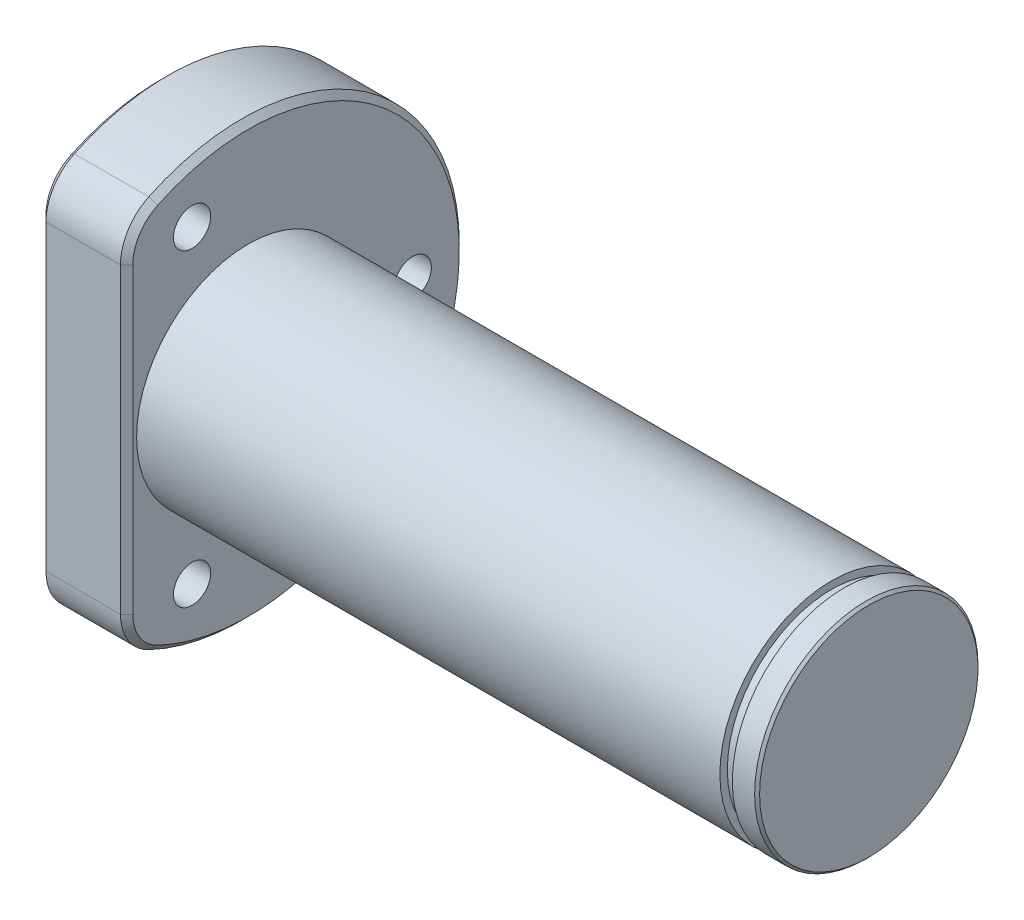
ISO-10303-21;
HEADER;
FILE_DESCRIPTION(('STEP AP214'),'2;1');
FILE_NAME('part.step','',(''),(''),'','','');
FILE_SCHEMA(('AUTOMOTIVE_DESIGN { 1 0 10303 214 1 1 1 1 }'));
ENDSEC;
DATA;
#1=APPLICATION_CONTEXT('core data for automotive mechanical design processes');
#2=APPLICATION_PROTOCOL_DEFINITION('international standard','automotive_design',2000,#1);
#3=PRODUCT_CONTEXT('',#1,'mechanical');
#4=PRODUCT('Part','Part','',(#3));
#5=PRODUCT_RELATED_PRODUCT_CATEGORY('part','',(#4));
#6=PRODUCT_DEFINITION_FORMATION('','',#4);
#7=PRODUCT_DEFINITION_CONTEXT('part definition',#1,'design');
#8=PRODUCT_DEFINITION('design','',#6,#7);
#9=PRODUCT_DEFINITION_SHAPE('','',#8);
#10=(LENGTH_UNIT() NAMED_UNIT(*) SI_UNIT(.MILLI.,.METRE.));
#11=(NAMED_UNIT(*) PLANE_ANGLE_UNIT() SI_UNIT($,.RADIAN.));
#12=(NAMED_UNIT(*) SI_UNIT($,.STERADIAN.) SOLID_ANGLE_UNIT());
#13=UNCERTAINTY_MEASURE_WITH_UNIT(LENGTH_MEASURE(1.E-05),#10,'distance_accuracy_value','');
#14=(GEOMETRIC_REPRESENTATION_CONTEXT(3) GLOBAL_UNCERTAINTY_ASSIGNED_CONTEXT((#13)) GLOBAL_UNIT_ASSIGNED_CONTEXT((#10,
#11,#12)) REPRESENTATION_CONTEXT('',''));
#15=CARTESIAN_POINT('',(0.,0.,0.));
#16=DIRECTION('',(0.,0.,1.));
#17=DIRECTION('',(1.,0.,0.));
#18=AXIS2_PLACEMENT_3D('',#15,#16,#17);
#19=CARTESIAN_POINT('',(7.,0.,-13.25));
#20=DIRECTION('',(-1.,0.,0.));
#21=DIRECTION('',(0.,0.,1.));
#22=AXIS2_PLACEMENT_3D('',#19,#20,#21);
#23=CYLINDRICAL_SURFACE('',#22,1.5);
#24=CARTESIAN_POINT('',(7.,0.,-13.25));
#25=DIRECTION('',(-1.,0.,0.));
#26=DIRECTION('',(0.,0.,1.));
#27=AXIS2_PLACEMENT_3D('',#24,#25,#26);
#28=CIRCLE('',#27,1.5);
#29=CARTESIAN_POINT('',(7.,0.,-11.75));
#30=VERTEX_POINT('',#29);
#31=EDGE_CURVE('E102',#30,#30,#28,.T.);
#32=ORIENTED_EDGE('',*,*,#31,.F.);
#33=EDGE_LOOP('',(#32));
#34=FACE_BOUND('',#33,.T.);
#35=CARTESIAN_POINT('',(3.5,0.,-13.25));
#36=DIRECTION('',(-1.,0.,0.));
#37=DIRECTION('',(0.,0.,1.));
#38=AXIS2_PLACEMENT_3D('',#35,#36,#37);
#39=CIRCLE('',#38,1.5);
#40=CARTESIAN_POINT('',(3.5,0.,-11.75));
#41=VERTEX_POINT('',#40);
#42=EDGE_CURVE('E132',#41,#41,#39,.F.);
#43=ORIENTED_EDGE('',*,*,#42,.F.);
#44=EDGE_LOOP('',(#43));
#45=FACE_BOUND('',#44,.T.);
#46=ADVANCED_FACE('F17',(#34,#45),#23,.F.);
#47=CARTESIAN_POINT('',(7.,-12.4509272254133,4.53176689906507));
#48=DIRECTION('',(-1.,0.,0.));
#49=DIRECTION('',(0.,0.,1.));
#50=AXIS2_PLACEMENT_3D('',#47,#48,#49);
#51=CYLINDRICAL_SURFACE('',#50,1.5);
#52=CARTESIAN_POINT('',(7.,-12.4509272254133,4.53176689906507));
#53=DIRECTION('',(-1.,0.,0.));
#54=DIRECTION('',(0.,0.,-1.));
#55=AXIS2_PLACEMENT_3D('',#52,#53,#54);
#56=CIRCLE('',#55,1.5);
#57=CARTESIAN_POINT('',(7.,-12.4509272254133,3.03176689906507));
#58=VERTEX_POINT('',#57);
#59=EDGE_CURVE('E127',#58,#58,#56,.T.);
#60=ORIENTED_EDGE('',*,*,#59,.F.);
#61=EDGE_LOOP('',(#60));
#62=FACE_BOUND('',#61,.T.);
#63=CARTESIAN_POINT('',(3.5,-12.4509272254133,4.53176689906507));
#64=DIRECTION('',(-1.,0.,0.));
#65=DIRECTION('',(0.,0.,1.));
#66=AXIS2_PLACEMENT_3D('',#63,#64,#65);
#67=CIRCLE('',#66,1.5);
#68=CARTESIAN_POINT('',(3.5,-12.4509272254133,6.03176689906507));
#69=VERTEX_POINT('',#68);
#70=EDGE_CURVE('E129',#69,#69,#67,.F.);
#71=ORIENTED_EDGE('',*,*,#70,.F.);
#72=EDGE_LOOP('',(#71));
#73=FACE_BOUND('',#72,.T.);
#74=ADVANCED_FACE('F308',(#62,#73),#51,.F.);
#75=CARTESIAN_POINT('',(7.,12.4509272254133,4.53176689906507));
#76=DIRECTION('',(-1.,0.,0.));
#77=DIRECTION('',(0.,0.,1.));
#78=AXIS2_PLACEMENT_3D('',#75,#76,#77);
#79=CYLINDRICAL_SURFACE('',#78,1.5);
#80=CARTESIAN_POINT('',(7.,12.4509272254133,4.53176689906507));
#81=DIRECTION('',(-1.,0.,0.));
#82=DIRECTION('',(0.,0.,1.));
#83=AXIS2_PLACEMENT_3D('',#80,#81,#82);
#84=CIRCLE('',#83,1.5);
#85=CARTESIAN_POINT('',(7.,12.4509272254133,6.03176689906507));
#86=VERTEX_POINT('',#85);
#87=EDGE_CURVE('E268',#86,#86,#84,.T.);
#88=ORIENTED_EDGE('',*,*,#87,.F.);
#89=EDGE_LOOP('',(#88));
#90=FACE_BOUND('',#89,.T.);
#91=CARTESIAN_POINT('',(3.5,12.4509272254133,4.53176689906507));
#92=DIRECTION('',(-1.,0.,0.));
#93=DIRECTION('',(0.,0.,1.));
#94=AXIS2_PLACEMENT_3D('',#91,#92,#93);
#95=CIRCLE('',#94,1.5);
#96=CARTESIAN_POINT('',(3.5,12.4509272254133,6.03176689906507));
#97=VERTEX_POINT('',#96);
#98=EDGE_CURVE('E124',#97,#97,#95,.F.);
#99=ORIENTED_EDGE('',*,*,#98,.F.);
#100=EDGE_LOOP('',(#99));
#101=FACE_BOUND('',#100,.T.);
#102=ADVANCED_FACE('F280',(#90,#101),#79,.F.);
#103=CARTESIAN_POINT('',(57.,0.,0.));
#104=DIRECTION('',(-1.,0.,0.));
#105=DIRECTION('',(0.,0.,1.));
#106=AXIS2_PLACEMENT_3D('',#103,#104,#105);
#107=CYLINDRICAL_SURFACE('',#106,9.);
#108=CARTESIAN_POINT('',(7.,0.,0.));
#109=DIRECTION('',(1.,0.,0.));
#110=DIRECTION('',(0.,0.,-1.));
#111=AXIS2_PLACEMENT_3D('',#108,#109,#110);
#112=CIRCLE('',#111,9.);
#113=CARTESIAN_POINT('',(7.,0.,-9.));
#114=VERTEX_POINT('',#113);
#115=EDGE_CURVE('E109',#114,#114,#112,.T.);
#116=ORIENTED_EDGE('',*,*,#115,.T.);
#117=EDGE_LOOP('',(#116));
#118=FACE_BOUND('',#117,.T.);
#119=CARTESIAN_POINT('',(54.,0.,0.));
#120=DIRECTION('',(1.,0.,0.));
#121=DIRECTION('',(0.,0.,-1.));
#122=AXIS2_PLACEMENT_3D('',#119,#120,#121);
#123=CIRCLE('',#122,9.);
#124=CARTESIAN_POINT('',(54.,0.,-9.));
#125=VERTEX_POINT('',#124);
#126=EDGE_CURVE('E113',#125,#125,#123,.F.);
#127=ORIENTED_EDGE('',*,*,#126,.T.);
#128=EDGE_LOOP('',(#127));
#129=FACE_BOUND('',#128,.T.);
#130=ADVANCED_FACE('F277',(#118,#129),#107,.T.);
#131=CARTESIAN_POINT('',(7.,0.,0.));
#132=DIRECTION('',(-1.,0.,0.));
#133=DIRECTION('',(0.,0.,1.));
#134=AXIS2_PLACEMENT_3D('',#131,#132,#133);
#135=CYLINDRICAL_SURFACE('',#134,17.5);
#136=DIRECTION('',(-1.,0.,0.));
#137=VECTOR('',#136,1.);
#138=CARTESIAN_POINT('',(7.,15.8025909042376,7.51851851851852));
#139=LINE('',#138,#137);
#140=CARTESIAN_POINT('',(0.499999999999987,15.8025909042376,7.51851851851852));
#141=VERTEX_POINT('',#140);
#142=CARTESIAN_POINT('',(6.5,15.8025909042376,7.51851851851852));
#143=VERTEX_POINT('',#142);
#144=EDGE_CURVE('E159',#141,#143,#139,.F.);
#145=ORIENTED_EDGE('',*,*,#144,.T.);
#146=CARTESIAN_POINT('',(6.5,0.,0.));
#147=DIRECTION('',(1.,0.,0.));
#148=DIRECTION('',(0.,0.,-1.));
#149=AXIS2_PLACEMENT_3D('',#146,#147,#148);
#150=CIRCLE('',#149,17.5);
#151=CARTESIAN_POINT('',(6.5,-15.8025909042376,7.51851851851852));
#152=VERTEX_POINT('',#151);
#153=EDGE_CURVE('E190',#143,#152,#150,.F.);
#154=ORIENTED_EDGE('',*,*,#153,.T.);
#155=DIRECTION('',(-1.,0.,0.));
#156=VECTOR('',#155,1.);
#157=CARTESIAN_POINT('',(7.,-15.8025909042376,7.51851851851852));
#158=LINE('',#157,#156);
#159=CARTESIAN_POINT('',(0.499999999999987,-15.8025909042376,7.51851851851852));
#160=VERTEX_POINT('',#159);
#161=EDGE_CURVE('E162',#152,#160,#158,.T.);
#162=ORIENTED_EDGE('',*,*,#161,.T.);
#163=CARTESIAN_POINT('',(0.499999999999987,0.,0.));
#164=DIRECTION('',(1.,0.,0.));
#165=DIRECTION('',(0.,0.,-1.));
#166=AXIS2_PLACEMENT_3D('',#163,#164,#165);
#167=CIRCLE('',#166,17.5);
#168=EDGE_CURVE('E188',#160,#141,#167,.T.);
#169=ORIENTED_EDGE('',*,*,#168,.T.);
#170=EDGE_LOOP('',(#145,#154,#162,#169));
#171=FACE_BOUND('',#170,.T.);
#172=ADVANCED_FACE('F252',(#171),#135,.T.);
#173=CARTESIAN_POINT('',(0.,0.,0.));
#174=DIRECTION('',(1.,0.,0.));
#175=DIRECTION('',(0.,0.,-1.));
#176=AXIS2_PLACEMENT_3D('',#173,#174,#175);
#177=PLANE('',#176);
#178=CARTESIAN_POINT('',(0.,-12.1905701261262,5.8));
#179=DIRECTION('',(1.,0.,0.));
#180=DIRECTION('',(0.,0.,-1.));
#181=AXIS2_PLACEMENT_3D('',#178,#179,#180);
#182=CIRCLE('',#181,3.5);
#183=CARTESIAN_POINT('',(0.,-15.3510883069737,7.30370370370371));
#184=VERTEX_POINT('',#183);
#185=CARTESIAN_POINT('',(0.,-12.1905701261262,9.3));
#186=VERTEX_POINT('',#185);
#187=EDGE_CURVE('E26',#184,#186,#182,.F.);
#188=ORIENTED_EDGE('',*,*,#187,.T.);
#189=DIRECTION('',(0.,1.,0.));
#190=VECTOR('',#189,1.);
#191=CARTESIAN_POINT('',(0.,12.1905701261262,9.3));
#192=LINE('',#191,#190);
#193=CARTESIAN_POINT('',(0.,12.1905701261262,9.3));
#194=VERTEX_POINT('',#193);
#195=EDGE_CURVE('E11',#186,#194,#192,.T.);
#196=ORIENTED_EDGE('',*,*,#195,.T.);
#197=CARTESIAN_POINT('',(0.,12.1905701261262,5.8));
#198=DIRECTION('',(1.,0.,0.));
#199=DIRECTION('',(0.,0.,-1.));
#200=AXIS2_PLACEMENT_3D('',#197,#198,#199);
#201=CIRCLE('',#200,3.5);
#202=CARTESIAN_POINT('',(0.,15.3510883069737,7.30370370370371));
#203=VERTEX_POINT('',#202);
#204=EDGE_CURVE('E194',#194,#203,#201,.F.);
#205=ORIENTED_EDGE('',*,*,#204,.T.);
#206=CARTESIAN_POINT('',(0.,0.,0.));
#207=DIRECTION('',(1.,0.,0.));
#208=DIRECTION('',(0.,0.,-1.));
#209=AXIS2_PLACEMENT_3D('',#206,#207,#208);
#210=CIRCLE('',#209,17.);
#211=EDGE_CURVE('E192',#203,#184,#210,.F.);
#212=ORIENTED_EDGE('',*,*,#211,.T.);
#213=EDGE_LOOP('',(#188,#196,#205,#212));
#214=FACE_BOUND('',#213,.T.);
#215=CARTESIAN_POINT('',(0.,-12.4509272254133,4.53176689906507));
#216=DIRECTION('',(1.,0.,0.));
#217=DIRECTION('',(0.,0.,-1.));
#218=AXIS2_PLACEMENT_3D('',#215,#216,#217);
#219=CIRCLE('',#218,2.95);
#220=CARTESIAN_POINT('',(0.,-12.4509272254133,1.58176689906507));
#221=VERTEX_POINT('',#220);
#222=EDGE_CURVE('E144',#221,#221,#219,.T.);
#223=ORIENTED_EDGE('',*,*,#222,.T.);
#224=EDGE_LOOP('',(#223));
#225=FACE_BOUND('',#224,.T.);
#226=CARTESIAN_POINT('',(0.,0.,-13.25));
#227=DIRECTION('',(1.,0.,0.));
#228=DIRECTION('',(0.,0.,-1.));
#229=AXIS2_PLACEMENT_3D('',#226,#227,#228);
#230=CIRCLE('',#229,2.95);
#231=CARTESIAN_POINT('',(0.,0.,-16.2));
#232=VERTEX_POINT('',#231);
#233=EDGE_CURVE('E141',#232,#232,#230,.T.);
#234=ORIENTED_EDGE('',*,*,#233,.T.);
#235=EDGE_LOOP('',(#234));
#236=FACE_BOUND('',#235,.T.);
#237=CARTESIAN_POINT('',(0.,12.4509272254133,4.53176689906507));
#238=DIRECTION('',(1.,0.,0.));
#239=DIRECTION('',(0.,0.,-1.));
#240=AXIS2_PLACEMENT_3D('',#237,#238,#239);
#241=CIRCLE('',#240,2.95);
#242=CARTESIAN_POINT('',(0.,12.4509272254133,1.58176689906507));
#243=VERTEX_POINT('',#242);
#244=EDGE_CURVE('E138',#243,#243,#241,.T.);
#245=ORIENTED_EDGE('',*,*,#244,.T.);
#246=EDGE_LOOP('',(#245));
#247=FACE_BOUND('',#246,.T.);
#248=CARTESIAN_POINT('',(0.,0.,0.));
#249=DIRECTION('',(-1.,0.,0.));
#250=DIRECTION('',(0.,0.,1.));
#251=AXIS2_PLACEMENT_3D('',#248,#249,#250);
#252=CIRCLE('',#251,3.4);
#253=CARTESIAN_POINT('',(0.,0.,3.4));
#254=VERTEX_POINT('',#253);
#255=EDGE_CURVE('E96',#254,#254,#252,.T.);
#256=ORIENTED_EDGE('',*,*,#255,.F.);
#257=EDGE_LOOP('',(#256));
#258=FACE_BOUND('',#257,.T.);
#259=ADVANCED_FACE('F223',(#214,#225,#236,#247,#258),#177,.F.);
#260=CARTESIAN_POINT('',(7.,0.,0.));
#261=DIRECTION('',(1.,0.,0.));
#262=DIRECTION('',(0.,0.,-1.));
#263=AXIS2_PLACEMENT_3D('',#260,#261,#262);
#264=PLANE('',#263);
#265=CARTESIAN_POINT('',(7.,12.1905701261262,5.8));
#266=DIRECTION('',(1.,0.,0.));
#267=DIRECTION('',(0.,0.,-1.));
#268=AXIS2_PLACEMENT_3D('',#265,#266,#267);
#269=CIRCLE('',#268,3.5);
#270=CARTESIAN_POINT('',(7.,15.3510883069737,7.3037037037037));
#271=VERTEX_POINT('',#270);
#272=CARTESIAN_POINT('',(7.,12.1905701261262,9.3));
#273=VERTEX_POINT('',#272);
#274=EDGE_CURVE('E173',#271,#273,#269,.T.);
#275=ORIENTED_EDGE('',*,*,#274,.T.);
#276=DIRECTION('',(0.,-1.,0.));
#277=VECTOR('',#276,1.);
#278=CARTESIAN_POINT('',(7.,0.,9.3));
#279=LINE('',#278,#277);
#280=CARTESIAN_POINT('',(7.,-12.1905701261262,9.3));
#281=VERTEX_POINT('',#280);
#282=EDGE_CURVE('E177',#273,#281,#279,.T.);
#283=ORIENTED_EDGE('',*,*,#282,.T.);
#284=CARTESIAN_POINT('',(7.,-12.1905701261262,5.8));
#285=DIRECTION('',(1.,0.,0.));
#286=DIRECTION('',(0.,0.,-1.));
#287=AXIS2_PLACEMENT_3D('',#284,#285,#286);
#288=CIRCLE('',#287,3.5);
#289=CARTESIAN_POINT('',(7.,-15.3510883069737,7.3037037037037));
#290=VERTEX_POINT('',#289);
#291=EDGE_CURVE('E175',#281,#290,#288,.T.);
#292=ORIENTED_EDGE('',*,*,#291,.T.);
#293=CARTESIAN_POINT('',(7.,0.,0.));
#294=DIRECTION('',(1.,0.,0.));
#295=DIRECTION('',(0.,0.,-1.));
#296=AXIS2_PLACEMENT_3D('',#293,#294,#295);
#297=CIRCLE('',#296,17.);
#298=EDGE_CURVE('E171',#290,#271,#297,.T.);
#299=ORIENTED_EDGE('',*,*,#298,.T.);
#300=EDGE_LOOP('',(#275,#283,#292,#299));
#301=FACE_BOUND('',#300,.T.);
#302=ORIENTED_EDGE('',*,*,#87,.T.);
#303=EDGE_LOOP('',(#302));
#304=FACE_BOUND('',#303,.T.);
#305=ORIENTED_EDGE('',*,*,#59,.T.);
#306=EDGE_LOOP('',(#305));
#307=FACE_BOUND('',#306,.T.);
#308=ORIENTED_EDGE('',*,*,#31,.T.);
#309=EDGE_LOOP('',(#308));
#310=FACE_BOUND('',#309,.T.);
#311=ORIENTED_EDGE('',*,*,#115,.F.);
#312=EDGE_LOOP('',(#311));
#313=FACE_BOUND('',#312,.T.);
#314=ADVANCED_FACE('F261',(#301,#304,#307,#310,#313),#264,.T.);
#315=CARTESIAN_POINT('',(-71.2374987497499,15.7924421883813,9.8));
#316=DIRECTION('',(0.,0.,1.));
#317=DIRECTION('',(0.,-1.,0.));
#318=AXIS2_PLACEMENT_3D('',#315,#316,#317);
#319=PLANE('',#318);
#320=DIRECTION('',(1.,0.,0.));
#321=VECTOR('',#320,1.);
#322=CARTESIAN_POINT('',(7.,-12.1905701261262,9.8));
#323=LINE('',#322,#321);
#324=CARTESIAN_POINT('',(0.499999999999987,-12.1905701261262,9.8));
#325=VERTEX_POINT('',#324);
#326=CARTESIAN_POINT('',(6.5,-12.1905701261262,9.8));
#327=VERTEX_POINT('',#326);
#328=EDGE_CURVE('E156',#325,#327,#323,.T.);
#329=ORIENTED_EDGE('',*,*,#328,.T.);
#330=DIRECTION('',(0.,1.,0.));
#331=VECTOR('',#330,1.);
#332=CARTESIAN_POINT('',(6.5,15.7924421883813,9.8));
#333=LINE('',#332,#331);
#334=CARTESIAN_POINT('',(6.5,12.1905701261262,9.8));
#335=VERTEX_POINT('',#334);
#336=EDGE_CURVE('E168',#327,#335,#333,.T.);
#337=ORIENTED_EDGE('',*,*,#336,.T.);
#338=DIRECTION('',(1.,0.,0.));
#339=VECTOR('',#338,1.);
#340=CARTESIAN_POINT('',(0.,12.1905701261262,9.8));
#341=LINE('',#340,#339);
#342=CARTESIAN_POINT('',(0.499999999999987,12.1905701261262,9.8));
#343=VERTEX_POINT('',#342);
#344=EDGE_CURVE('E153',#335,#343,#341,.F.);
#345=ORIENTED_EDGE('',*,*,#344,.T.);
#346=DIRECTION('',(0.,-1.,0.));
#347=VECTOR('',#346,1.);
#348=CARTESIAN_POINT('',(0.499999999999987,-12.1905701261262,9.8));
#349=LINE('',#348,#347);
#350=EDGE_CURVE('E165',#343,#325,#349,.T.);
#351=ORIENTED_EDGE('',*,*,#350,.T.);
#352=EDGE_LOOP('',(#329,#337,#345,#351));
#353=FACE_BOUND('',#352,.T.);
#354=ADVANCED_FACE('F232',(#353),#319,.T.);
#355=CARTESIAN_POINT('',(54.,0.,-3.85));
#356=DIRECTION('',(1.,0.,0.));
#357=DIRECTION('',(0.,0.,-1.));
#358=AXIS2_PLACEMENT_3D('',#355,#356,#357);
#359=PLANE('',#358);
#360=ORIENTED_EDGE('',*,*,#126,.F.);
#361=EDGE_LOOP('',(#360));
#362=FACE_BOUND('',#361,.T.);
#363=CARTESIAN_POINT('',(54.,0.,0.));
#364=DIRECTION('',(1.,0.,0.));
#365=DIRECTION('',(0.,0.,-1.));
#366=AXIS2_PLACEMENT_3D('',#363,#364,#365);
#367=CIRCLE('',#366,8.4);
#368=CARTESIAN_POINT('',(54.,0.,-8.4));
#369=VERTEX_POINT('',#368);
#370=EDGE_CURVE('E99',#369,#369,#367,.T.);
#371=ORIENTED_EDGE('',*,*,#370,.F.);
#372=EDGE_LOOP('',(#371));
#373=FACE_BOUND('',#372,.T.);
#374=ADVANCED_FACE('F285',(#362,#373),#359,.T.);
#375=CARTESIAN_POINT('',(55.,0.,-3.85));
#376=DIRECTION('',(1.,0.,0.));
#377=DIRECTION('',(0.,0.,-1.));
#378=AXIS2_PLACEMENT_3D('',#375,#376,#377);
#379=PLANE('',#378);
#380=CARTESIAN_POINT('',(55.,0.,0.));
#381=DIRECTION('',(1.,0.,0.));
#382=DIRECTION('',(0.,0.,-1.));
#383=AXIS2_PLACEMENT_3D('',#380,#381,#382);
#384=CIRCLE('',#383,9.);
#385=CARTESIAN_POINT('',(55.,0.,-9.));
#386=VERTEX_POINT('',#385);
#387=EDGE_CURVE('E107',#386,#386,#384,.F.);
#388=ORIENTED_EDGE('',*,*,#387,.T.);
#389=EDGE_LOOP('',(#388));
#390=FACE_BOUND('',#389,.T.);
#391=CARTESIAN_POINT('',(55.,0.,0.));
#392=DIRECTION('',(1.,0.,0.));
#393=DIRECTION('',(0.,0.,-1.));
#394=AXIS2_PLACEMENT_3D('',#391,#392,#393);
#395=CIRCLE('',#394,8.4);
#396=CARTESIAN_POINT('',(55.,0.,-8.4));
#397=VERTEX_POINT('',#396);
#398=EDGE_CURVE('E95',#397,#397,#395,.T.);
#399=ORIENTED_EDGE('',*,*,#398,.T.);
#400=EDGE_LOOP('',(#399));
#401=FACE_BOUND('',#400,.T.);
#402=ADVANCED_FACE('F288',(#390,#401),#379,.F.);
#403=CARTESIAN_POINT('',(54.,0.,0.));
#404=DIRECTION('',(1.,0.,0.));
#405=DIRECTION('',(0.,0.,-1.));
#406=AXIS2_PLACEMENT_3D('',#403,#404,#405);
#407=CYLINDRICAL_SURFACE('',#406,8.4);
#408=ORIENTED_EDGE('',*,*,#370,.T.);
#409=EDGE_LOOP('',(#408));
#410=FACE_BOUND('',#409,.T.);
#411=ORIENTED_EDGE('',*,*,#398,.F.);
#412=EDGE_LOOP('',(#411));
#413=FACE_BOUND('',#412,.T.);
#414=ADVANCED_FACE('F292',(#410,#413),#407,.T.);
#415=CARTESIAN_POINT('',(57.,0.,0.));
#416=DIRECTION('',(-1.,0.,0.));
#417=DIRECTION('',(0.,0.,1.));
#418=AXIS2_PLACEMENT_3D('',#415,#416,#417);
#419=PLANE('',#418);
#420=CARTESIAN_POINT('',(57.,0.,0.));
#421=DIRECTION('',(-1.,0.,0.));
#422=DIRECTION('',(0.,0.,1.));
#423=AXIS2_PLACEMENT_3D('',#420,#421,#422);
#424=CIRCLE('',#423,8.8);
#425=CARTESIAN_POINT('',(57.,0.,8.8));
#426=VERTEX_POINT('',#425);
#427=EDGE_CURVE('E120',#426,#426,#424,.F.);
#428=ORIENTED_EDGE('',*,*,#427,.T.);
#429=EDGE_LOOP('',(#428));
#430=FACE_BOUND('',#429,.T.);
#431=ADVANCED_FACE('F295',(#430),#419,.F.);
#432=CARTESIAN_POINT('',(56.8,0.,0.));
#433=DIRECTION('',(-1.,0.,0.));
#434=DIRECTION('',(0.,0.,1.));
#435=AXIS2_PLACEMENT_3D('',#432,#433,#434);
#436=CIRCLE('',#435,9.);
#437=CARTESIAN_POINT('',(56.8,0.,9.));
#438=VERTEX_POINT('',#437);
#439=EDGE_CURVE('E112',#438,#438,#436,.T.);
#440=ORIENTED_EDGE('',*,*,#439,.T.);
#441=EDGE_LOOP('',(#440));
#442=FACE_BOUND('',#441,.T.);
#443=ORIENTED_EDGE('',*,*,#387,.F.);
#444=EDGE_LOOP('',(#443));
#445=FACE_BOUND('',#444,.T.);
#446=ADVANCED_FACE('F282',(#442,#445),#107,.T.);
#447=CARTESIAN_POINT('',(56.8,0.,0.));
#448=DIRECTION('',(-1.,0.,0.));
#449=DIRECTION('',(0.,0.,1.));
#450=AXIS2_PLACEMENT_3D('',#447,#448,#449);
#451=CONICAL_SURFACE('',#450,9.,0.785398163397431);
#452=ORIENTED_EDGE('',*,*,#427,.F.);
#453=EDGE_LOOP('',(#452));
#454=FACE_BOUND('',#453,.T.);
#455=ORIENTED_EDGE('',*,*,#439,.F.);
#456=EDGE_LOOP('',(#455));
#457=FACE_BOUND('',#456,.T.);
#458=ADVANCED_FACE('F89',(#454,#457),#451,.T.);
#459=CARTESIAN_POINT('',(20.,0.,0.));
#460=DIRECTION('',(-1.,0.,0.));
#461=DIRECTION('',(0.,0.,1.));
#462=AXIS2_PLACEMENT_3D('',#459,#460,#461);
#463=CONICAL_SURFACE('',#462,3.4,1.0471975511966);
#464=CARTESIAN_POINT('',(21.9629909152447,0.,0.));
#465=VERTEX_POINT('',#464);
#466=VERTEX_LOOP('',#465);
#467=FACE_BOUND('',#466,.T.);
#468=CARTESIAN_POINT('',(20.,0.,0.));
#469=DIRECTION('',(-1.,0.,0.));
#470=DIRECTION('',(0.,0.,1.));
#471=AXIS2_PLACEMENT_3D('',#468,#469,#470);
#472=CIRCLE('',#471,3.4);
#473=CARTESIAN_POINT('',(20.,0.,3.4));
#474=VERTEX_POINT('',#473);
#475=EDGE_CURVE('E93',#474,#474,#472,.T.);
#476=ORIENTED_EDGE('',*,*,#475,.T.);
#477=EDGE_LOOP('',(#476));
#478=FACE_BOUND('',#477,.T.);
#479=ADVANCED_FACE('F85',(#467,#478),#463,.F.);
#480=CARTESIAN_POINT('',(0.,0.,0.));
#481=DIRECTION('',(-1.,0.,0.));
#482=DIRECTION('',(0.,0.,1.));
#483=AXIS2_PLACEMENT_3D('',#480,#481,#482);
#484=CYLINDRICAL_SURFACE('',#483,3.4);
#485=ORIENTED_EDGE('',*,*,#475,.F.);
#486=EDGE_LOOP('',(#485));
#487=FACE_BOUND('',#486,.T.);
#488=ORIENTED_EDGE('',*,*,#255,.T.);
#489=EDGE_LOOP('',(#488));
#490=FACE_BOUND('',#489,.T.);
#491=ADVANCED_FACE('F88',(#487,#490),#484,.F.);
#492=CARTESIAN_POINT('',(3.5,12.4509272254133,4.53176689906507));
#493=DIRECTION('',(-1.,0.,0.));
#494=DIRECTION('',(0.,0.,1.));
#495=AXIS2_PLACEMENT_3D('',#492,#493,#494);
#496=PLANE('',#495);
#497=CARTESIAN_POINT('',(3.5,12.4509272254133,4.53176689906507));
#498=DIRECTION('',(-1.,0.,0.));
#499=DIRECTION('',(0.,0.,1.));
#500=AXIS2_PLACEMENT_3D('',#497,#498,#499);
#501=CIRCLE('',#500,2.75);
#502=CARTESIAN_POINT('',(3.5,12.4509272254133,7.28176689906507));
#503=VERTEX_POINT('',#502);
#504=EDGE_CURVE('E128',#503,#503,#501,.T.);
#505=ORIENTED_EDGE('',*,*,#504,.T.);
#506=EDGE_LOOP('',(#505));
#507=FACE_BOUND('',#506,.T.);
#508=ORIENTED_EDGE('',*,*,#98,.T.);
#509=EDGE_LOOP('',(#508));
#510=FACE_BOUND('',#509,.T.);
#511=ADVANCED_FACE('F321',(#507,#510),#496,.T.);
#512=CARTESIAN_POINT('',(3.5,12.4509272254133,4.53176689906507));
#513=DIRECTION('',(-1.,0.,0.));
#514=DIRECTION('',(0.,0.,1.));
#515=AXIS2_PLACEMENT_3D('',#512,#513,#514);
#516=CYLINDRICAL_SURFACE('',#515,2.75);
#517=CARTESIAN_POINT('',(0.199999999999997,12.4509272254133,4.53176689906507));
#518=DIRECTION('',(1.,0.,0.));
#519=DIRECTION('',(0.,0.,-1.));
#520=AXIS2_PLACEMENT_3D('',#517,#518,#519);
#521=CIRCLE('',#520,2.75);
#522=CARTESIAN_POINT('',(0.199999999999997,12.4509272254133,1.78176689906507));
#523=VERTEX_POINT('',#522);
#524=EDGE_CURVE('E150',#523,#523,#521,.F.);
#525=ORIENTED_EDGE('',*,*,#524,.T.);
#526=EDGE_LOOP('',(#525));
#527=FACE_BOUND('',#526,.T.);
#528=ORIENTED_EDGE('',*,*,#504,.F.);
#529=EDGE_LOOP('',(#528));
#530=FACE_BOUND('',#529,.T.);
#531=ADVANCED_FACE('F327',(#527,#530),#516,.F.);
#532=CARTESIAN_POINT('',(3.5,-12.4509272254133,4.53176689906507));
#533=DIRECTION('',(-1.,0.,0.));
#534=DIRECTION('',(0.,0.,1.));
#535=AXIS2_PLACEMENT_3D('',#532,#533,#534);
#536=PLANE('',#535);
#537=CARTESIAN_POINT('',(3.5,-12.4509272254133,4.53176689906507));
#538=DIRECTION('',(-1.,0.,0.));
#539=DIRECTION('',(0.,0.,1.));
#540=AXIS2_PLACEMENT_3D('',#537,#538,#539);
#541=CIRCLE('',#540,2.75);
#542=CARTESIAN_POINT('',(3.5,-12.4509272254133,7.28176689906507));
#543=VERTEX_POINT('',#542);
#544=EDGE_CURVE('E207',#543,#543,#541,.T.);
#545=ORIENTED_EDGE('',*,*,#544,.T.);
#546=EDGE_LOOP('',(#545));
#547=FACE_BOUND('',#546,.T.);
#548=ORIENTED_EDGE('',*,*,#70,.T.);
#549=EDGE_LOOP('',(#548));
#550=FACE_BOUND('',#549,.T.);
#551=ADVANCED_FACE('F454',(#547,#550),#536,.T.);
#552=CARTESIAN_POINT('',(3.5,-12.4509272254133,4.53176689906507));
#553=DIRECTION('',(-1.,0.,0.));
#554=DIRECTION('',(0.,0.,1.));
#555=AXIS2_PLACEMENT_3D('',#552,#553,#554);
#556=CYLINDRICAL_SURFACE('',#555,2.75);
#557=CARTESIAN_POINT('',(0.199999999999997,-12.4509272254133,4.53176689906507));
#558=DIRECTION('',(1.,0.,0.));
#559=DIRECTION('',(0.,0.,-1.));
#560=AXIS2_PLACEMENT_3D('',#557,#558,#559);
#561=CIRCLE('',#560,2.75);
#562=CARTESIAN_POINT('',(0.199999999999997,-12.4509272254133,1.78176689906507));
#563=VERTEX_POINT('',#562);
#564=EDGE_CURVE('E123',#563,#563,#561,.F.);
#565=ORIENTED_EDGE('',*,*,#564,.T.);
#566=EDGE_LOOP('',(#565));
#567=FACE_BOUND('',#566,.T.);
#568=ORIENTED_EDGE('',*,*,#544,.F.);
#569=EDGE_LOOP('',(#568));
#570=FACE_BOUND('',#569,.T.);
#571=ADVANCED_FACE('F445',(#567,#570),#556,.F.);
#572=CARTESIAN_POINT('',(3.5,0.,-13.25));
#573=DIRECTION('',(-1.,0.,0.));
#574=DIRECTION('',(0.,0.,1.));
#575=AXIS2_PLACEMENT_3D('',#572,#573,#574);
#576=PLANE('',#575);
#577=CARTESIAN_POINT('',(3.5,0.,-13.25));
#578=DIRECTION('',(-1.,0.,0.));
#579=DIRECTION('',(0.,0.,1.));
#580=AXIS2_PLACEMENT_3D('',#577,#578,#579);
#581=CIRCLE('',#580,2.75);
#582=CARTESIAN_POINT('',(3.5,0.,-10.5));
#583=VERTEX_POINT('',#582);
#584=EDGE_CURVE('E133',#583,#583,#581,.T.);
#585=ORIENTED_EDGE('',*,*,#584,.T.);
#586=EDGE_LOOP('',(#585));
#587=FACE_BOUND('',#586,.T.);
#588=ORIENTED_EDGE('',*,*,#42,.T.);
#589=EDGE_LOOP('',(#588));
#590=FACE_BOUND('',#589,.T.);
#591=ADVANCED_FACE('F436',(#587,#590),#576,.T.);
#592=CARTESIAN_POINT('',(3.5,0.,-13.25));
#593=DIRECTION('',(-1.,0.,0.));
#594=DIRECTION('',(0.,0.,1.));
#595=AXIS2_PLACEMENT_3D('',#592,#593,#594);
#596=CYLINDRICAL_SURFACE('',#595,2.75);
#597=CARTESIAN_POINT('',(0.2,0.,-13.25));
#598=DIRECTION('',(1.,0.,0.));
#599=DIRECTION('',(0.,0.,-1.));
#600=AXIS2_PLACEMENT_3D('',#597,#598,#599);
#601=CIRCLE('',#600,2.75);
#602=CARTESIAN_POINT('',(0.2,0.,-16.));
#603=VERTEX_POINT('',#602);
#604=EDGE_CURVE('E147',#603,#603,#601,.F.);
#605=ORIENTED_EDGE('',*,*,#604,.T.);
#606=EDGE_LOOP('',(#605));
#607=FACE_BOUND('',#606,.T.);
#608=ORIENTED_EDGE('',*,*,#584,.F.);
#609=EDGE_LOOP('',(#608));
#610=FACE_BOUND('',#609,.T.);
#611=ADVANCED_FACE('F349',(#607,#610),#596,.F.);
#612=CARTESIAN_POINT('',(0.199999999999997,-12.4509272254133,4.53176689906507));
#613=DIRECTION('',(-1.,0.,0.));
#614=DIRECTION('',(0.,0.,1.));
#615=AXIS2_PLACEMENT_3D('',#612,#613,#614);
#616=CONICAL_SURFACE('',#615,2.75,0.785398163397459);
#617=ORIENTED_EDGE('',*,*,#222,.F.);
#618=EDGE_LOOP('',(#617));
#619=FACE_BOUND('',#618,.T.);
#620=ORIENTED_EDGE('',*,*,#564,.F.);
#621=EDGE_LOOP('',(#620));
#622=FACE_BOUND('',#621,.T.);
#623=ADVANCED_FACE('F345',(#619,#622),#616,.F.);
#624=CARTESIAN_POINT('',(0.2,0.,-13.25));
#625=DIRECTION('',(-1.,0.,0.));
#626=DIRECTION('',(0.,0.,1.));
#627=AXIS2_PLACEMENT_3D('',#624,#625,#626);
#628=CONICAL_SURFACE('',#627,2.75,0.785398163397459);
#629=ORIENTED_EDGE('',*,*,#233,.F.);
#630=EDGE_LOOP('',(#629));
#631=FACE_BOUND('',#630,.T.);
#632=ORIENTED_EDGE('',*,*,#604,.F.);
#633=EDGE_LOOP('',(#632));
#634=FACE_BOUND('',#633,.T.);
#635=ADVANCED_FACE('F348',(#631,#634),#628,.F.);
#636=CARTESIAN_POINT('',(0.199999999999997,12.4509272254133,4.53176689906507));
#637=DIRECTION('',(-1.,0.,0.));
#638=DIRECTION('',(0.,0.,1.));
#639=AXIS2_PLACEMENT_3D('',#636,#637,#638);
#640=CONICAL_SURFACE('',#639,2.75,0.785398163397459);
#641=ORIENTED_EDGE('',*,*,#244,.F.);
#642=EDGE_LOOP('',(#641));
#643=FACE_BOUND('',#642,.T.);
#644=ORIENTED_EDGE('',*,*,#524,.F.);
#645=EDGE_LOOP('',(#644));
#646=FACE_BOUND('',#645,.T.);
#647=ADVANCED_FACE('F353',(#643,#646),#640,.F.);
#648=CARTESIAN_POINT('',(7.,-12.1905701261262,5.8));
#649=DIRECTION('',(-1.,0.,0.));
#650=DIRECTION('',(0.,0.,1.));
#651=AXIS2_PLACEMENT_3D('',#648,#649,#650);
#652=CYLINDRICAL_SURFACE('',#651,4.);
#653=ORIENTED_EDGE('',*,*,#161,.F.);
#654=CARTESIAN_POINT('',(6.5,-12.1905701261262,5.8));
#655=DIRECTION('',(1.,0.,0.));
#656=DIRECTION('',(0.,0.,-1.));
#657=AXIS2_PLACEMENT_3D('',#654,#655,#656);
#658=CIRCLE('',#657,4.);
#659=EDGE_CURVE('E182',#152,#327,#658,.F.);
#660=ORIENTED_EDGE('',*,*,#659,.T.);
#661=ORIENTED_EDGE('',*,*,#328,.F.);
#662=CARTESIAN_POINT('',(0.499999999999987,-12.1905701261262,5.8));
#663=DIRECTION('',(1.,0.,0.));
#664=DIRECTION('',(0.,0.,-1.));
#665=AXIS2_PLACEMENT_3D('',#662,#663,#664);
#666=CIRCLE('',#665,4.);
#667=EDGE_CURVE('E180',#325,#160,#666,.T.);
#668=ORIENTED_EDGE('',*,*,#667,.T.);
#669=EDGE_LOOP('',(#653,#660,#661,#668));
#670=FACE_BOUND('',#669,.T.);
#671=ADVANCED_FACE('F235',(#670),#652,.T.);
#672=CARTESIAN_POINT('',(7.,12.1905701261262,5.8));
#673=DIRECTION('',(-1.,0.,0.));
#674=DIRECTION('',(0.,0.,1.));
#675=AXIS2_PLACEMENT_3D('',#672,#673,#674);
#676=CYLINDRICAL_SURFACE('',#675,4.);
#677=ORIENTED_EDGE('',*,*,#344,.F.);
#678=CARTESIAN_POINT('',(6.5,12.1905701261262,5.8));
#679=DIRECTION('',(1.,0.,0.));
#680=DIRECTION('',(0.,0.,-1.));
#681=AXIS2_PLACEMENT_3D('',#678,#679,#680);
#682=CIRCLE('',#681,4.);
#683=EDGE_CURVE('E186',#335,#143,#682,.F.);
#684=ORIENTED_EDGE('',*,*,#683,.T.);
#685=ORIENTED_EDGE('',*,*,#144,.F.);
#686=CARTESIAN_POINT('',(0.499999999999987,12.1905701261262,5.8));
#687=DIRECTION('',(1.,0.,0.));
#688=DIRECTION('',(0.,0.,-1.));
#689=AXIS2_PLACEMENT_3D('',#686,#687,#688);
#690=CIRCLE('',#689,4.);
#691=EDGE_CURVE('E184',#141,#343,#690,.T.);
#692=ORIENTED_EDGE('',*,*,#691,.T.);
#693=EDGE_LOOP('',(#677,#684,#685,#692));
#694=FACE_BOUND('',#693,.T.);
#695=ADVANCED_FACE('F248',(#694),#676,.T.);
#696=CARTESIAN_POINT('',(7.,0.,0.));
#697=DIRECTION('',(-1.,0.,0.));
#698=DIRECTION('',(0.,0.,1.));
#699=AXIS2_PLACEMENT_3D('',#696,#697,#698);
#700=CONICAL_SURFACE('',#699,17.,0.785398163397441);
#701=DIRECTION('',(-0.707106781186552,0.638521096497327,0.303794024509773));
#702=VECTOR('',#701,1.);
#703=CARTESIAN_POINT('',(7.,15.3510883069737,7.3037037037037));
#704=LINE('',#703,#702);
#705=EDGE_CURVE('E201',#271,#143,#704,.T.);
#706=ORIENTED_EDGE('',*,*,#705,.F.);
#707=ORIENTED_EDGE('',*,*,#298,.F.);
#708=DIRECTION('',(0.707106781186555,0.638521096497325,-0.303794024509772));
#709=VECTOR('',#708,1.);
#710=CARTESIAN_POINT('',(6.5,-15.8025909042376,7.51851851851852));
#711=LINE('',#710,#709);
#712=EDGE_CURVE('E204',#152,#290,#711,.T.);
#713=ORIENTED_EDGE('',*,*,#712,.F.);
#714=ORIENTED_EDGE('',*,*,#153,.F.);
#715=EDGE_LOOP('',(#706,#707,#713,#714));
#716=FACE_BOUND('',#715,.T.);
#717=ADVANCED_FACE('F255',(#716),#700,.T.);
#718=CARTESIAN_POINT('',(7.,-12.1905701261262,5.8));
#719=DIRECTION('',(-1.,0.,0.));
#720=DIRECTION('',(0.,0.,1.));
#721=AXIS2_PLACEMENT_3D('',#718,#719,#720);
#722=CONICAL_SURFACE('',#721,3.5,0.785398163397441);
#723=ORIENTED_EDGE('',*,*,#712,.T.);
#724=ORIENTED_EDGE('',*,*,#291,.F.);
#725=DIRECTION('',(0.707106781186553,0.,-0.707106781186543));
#726=VECTOR('',#725,1.);
#727=CARTESIAN_POINT('',(6.5,-12.1905701261262,9.8));
#728=LINE('',#727,#726);
#729=EDGE_CURVE('E199',#327,#281,#728,.T.);
#730=ORIENTED_EDGE('',*,*,#729,.F.);
#731=ORIENTED_EDGE('',*,*,#659,.F.);
#732=EDGE_LOOP('',(#723,#724,#730,#731));
#733=FACE_BOUND('',#732,.T.);
#734=ADVANCED_FACE('F239',(#733),#722,.T.);
#735=CARTESIAN_POINT('',(7.,12.1905701261262,5.8));
#736=DIRECTION('',(-1.,0.,0.));
#737=DIRECTION('',(0.,0.,1.));
#738=AXIS2_PLACEMENT_3D('',#735,#736,#737);
#739=CONICAL_SURFACE('',#738,3.5,0.785398163397441);
#740=ORIENTED_EDGE('',*,*,#705,.T.);
#741=ORIENTED_EDGE('',*,*,#683,.F.);
#742=DIRECTION('',(-0.707106781186554,0.,0.707106781186541));
#743=VECTOR('',#742,1.);
#744=CARTESIAN_POINT('',(7.,12.1905701261262,9.3));
#745=LINE('',#744,#743);
#746=EDGE_CURVE('E197',#273,#335,#745,.T.);
#747=ORIENTED_EDGE('',*,*,#746,.F.);
#748=ORIENTED_EDGE('',*,*,#274,.F.);
#749=EDGE_LOOP('',(#740,#741,#747,#748));
#750=FACE_BOUND('',#749,.T.);
#751=ADVANCED_FACE('F259',(#750),#739,.T.);
#752=CARTESIAN_POINT('',(6.5,15.7924421883813,9.8));
#753=DIRECTION('',(-0.707106781186544,0.,-0.707106781186551));
#754=DIRECTION('',(0.,1.,0.));
#755=AXIS2_PLACEMENT_3D('',#752,#753,#754);
#756=PLANE('',#755);
#757=ORIENTED_EDGE('',*,*,#729,.T.);
#758=ORIENTED_EDGE('',*,*,#282,.F.);
#759=ORIENTED_EDGE('',*,*,#746,.T.);
#760=ORIENTED_EDGE('',*,*,#336,.F.);
#761=EDGE_LOOP('',(#757,#758,#759,#760));
#762=FACE_BOUND('',#761,.T.);
#763=ADVANCED_FACE('F244',(#762),#756,.F.);
#764=CARTESIAN_POINT('',(0.499999999999987,0.,0.));
#765=DIRECTION('',(1.,0.,0.));
#766=DIRECTION('',(0.,0.,-1.));
#767=AXIS2_PLACEMENT_3D('',#764,#765,#766);
#768=CONICAL_SURFACE('',#767,17.5,0.785398163397452);
#769=DIRECTION('',(0.707106781186545,-0.638521096497333,0.303794024509776));
#770=VECTOR('',#769,1.);
#771=CARTESIAN_POINT('',(0.,-15.3510883069737,7.30370370370371));
#772=LINE('',#771,#770);
#773=EDGE_CURVE('E210',#184,#160,#772,.T.);
#774=ORIENTED_EDGE('',*,*,#773,.F.);
#775=ORIENTED_EDGE('',*,*,#211,.F.);
#776=DIRECTION('',(-0.707106781186544,-0.638521096497334,-0.303794024509777));
#777=VECTOR('',#776,1.);
#778=CARTESIAN_POINT('',(0.499999999999987,15.8025909042376,7.51851851851852));
#779=LINE('',#778,#777);
#780=EDGE_CURVE('E21',#141,#203,#779,.T.);
#781=ORIENTED_EDGE('',*,*,#780,.F.);
#782=ORIENTED_EDGE('',*,*,#168,.F.);
#783=EDGE_LOOP('',(#774,#775,#781,#782));
#784=FACE_BOUND('',#783,.T.);
#785=ADVANCED_FACE('F19',(#784),#768,.T.);
#786=CARTESIAN_POINT('',(0.,12.1905701261262,5.8));
#787=DIRECTION('',(1.,0.,0.));
#788=DIRECTION('',(0.,0.,-1.));
#789=AXIS2_PLACEMENT_3D('',#786,#787,#788);
#790=CONICAL_SURFACE('',#789,3.5,0.785398163397452);
#791=ORIENTED_EDGE('',*,*,#780,.T.);
#792=ORIENTED_EDGE('',*,*,#204,.F.);
#793=DIRECTION('',(-0.707106781186545,0.,-0.70710678118655));
#794=VECTOR('',#793,1.);
#795=CARTESIAN_POINT('',(0.499999999999987,12.1905701261262,9.8));
#796=LINE('',#795,#794);
#797=EDGE_CURVE('E39',#343,#194,#796,.T.);
#798=ORIENTED_EDGE('',*,*,#797,.F.);
#799=ORIENTED_EDGE('',*,*,#691,.F.);
#800=EDGE_LOOP('',(#791,#792,#798,#799));
#801=FACE_BOUND('',#800,.T.);
#802=ADVANCED_FACE('F219',(#801),#790,.T.);
#803=CARTESIAN_POINT('',(0.,-12.1905701261262,5.8));
#804=DIRECTION('',(1.,0.,0.));
#805=DIRECTION('',(0.,0.,-1.));
#806=AXIS2_PLACEMENT_3D('',#803,#804,#805);
#807=CONICAL_SURFACE('',#806,3.5,0.78539816339745);
#808=ORIENTED_EDGE('',*,*,#773,.T.);
#809=ORIENTED_EDGE('',*,*,#667,.F.);
#810=DIRECTION('',(0.707106781186545,0.,0.70710678118655));
#811=VECTOR('',#810,1.);
#812=CARTESIAN_POINT('',(0.,-12.1905701261262,9.3));
#813=LINE('',#812,#811);
#814=EDGE_CURVE('E208',#186,#325,#813,.T.);
#815=ORIENTED_EDGE('',*,*,#814,.F.);
#816=ORIENTED_EDGE('',*,*,#187,.F.);
#817=EDGE_LOOP('',(#808,#809,#815,#816));
#818=FACE_BOUND('',#817,.T.);
#819=ADVANCED_FACE('F227',(#818),#807,.T.);
#820=CARTESIAN_POINT('',(0.499999999999987,15.7924421883813,9.8));
#821=DIRECTION('',(-0.70710678118655,0.,0.707106781186545));
#822=DIRECTION('',(0.,1.,0.));
#823=AXIS2_PLACEMENT_3D('',#820,#821,#822);
#824=PLANE('',#823);
#825=ORIENTED_EDGE('',*,*,#797,.T.);
#826=ORIENTED_EDGE('',*,*,#195,.F.);
#827=ORIENTED_EDGE('',*,*,#814,.T.);
#828=ORIENTED_EDGE('',*,*,#350,.F.);
#829=EDGE_LOOP('',(#825,#826,#827,#828));
#830=FACE_BOUND('',#829,.T.);
#831=ADVANCED_FACE('F226',(#830),#824,.T.);
#832=CLOSED_SHELL('',(#46,#74,#102,#130,#172,#259,#314,#354,#374,#402,#414,#431,#446,#458,#479,
#491,#511,#531,#551,#571,#591,#611,#623,#635,#647,#671,#695,#717,#734,#751,#763,#785,#802,#819,#831));
#833=MANIFOLD_SOLID_BREP('B1',#832);
#834=ADVANCED_BREP_SHAPE_REPRESENTATION('',(#18,#833),#14);
#835=SHAPE_DEFINITION_REPRESENTATION(#9,#834);
ENDSEC;
END-ISO-10303-21;
